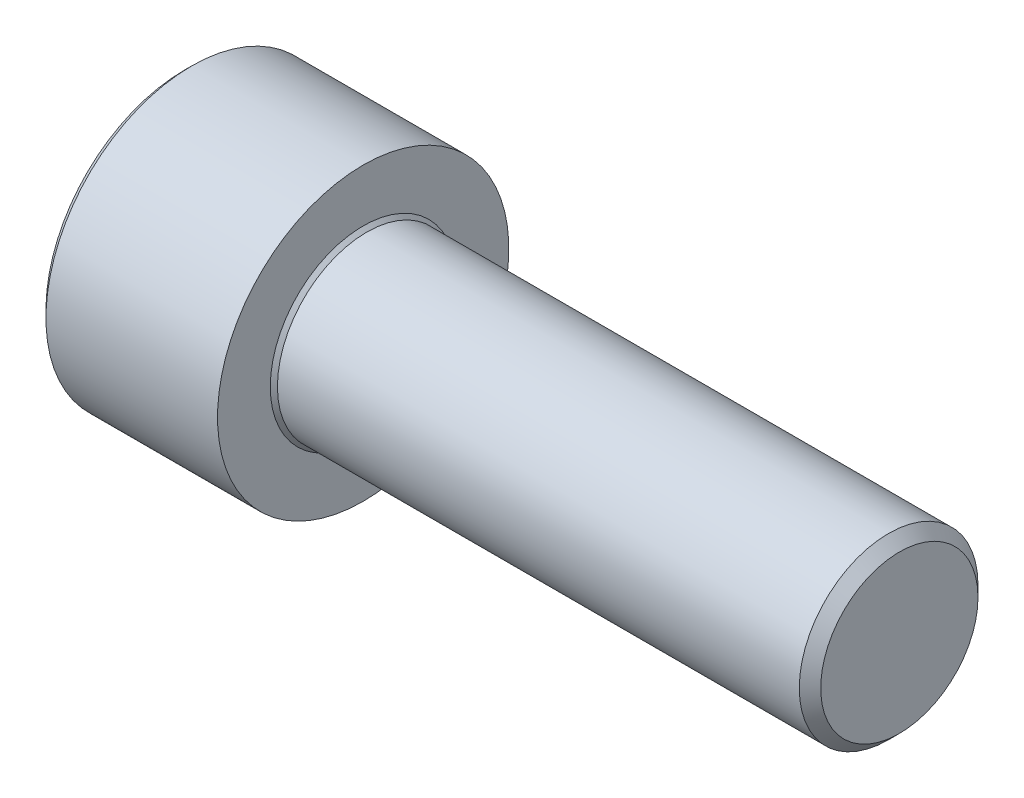
ISO-10303-21;
HEADER;
FILE_DESCRIPTION(('STEP AP214'),'2;1');
FILE_NAME('part.step','',(''),(''),'','','');
FILE_SCHEMA(('AUTOMOTIVE_DESIGN { 1 0 10303 214 1 1 1 1 }'));
ENDSEC;
DATA;
#1=APPLICATION_CONTEXT('core data for automotive mechanical design processes');
#2=APPLICATION_PROTOCOL_DEFINITION('international standard','automotive_design',2000,#1);
#3=PRODUCT_CONTEXT('',#1,'mechanical');
#4=PRODUCT('Part','Part','',(#3));
#5=PRODUCT_RELATED_PRODUCT_CATEGORY('part','',(#4));
#6=PRODUCT_DEFINITION_FORMATION('','',#4);
#7=PRODUCT_DEFINITION_CONTEXT('part definition',#1,'design');
#8=PRODUCT_DEFINITION('design','',#6,#7);
#9=PRODUCT_DEFINITION_SHAPE('','',#8);
#10=(LENGTH_UNIT() NAMED_UNIT(*) SI_UNIT(.MILLI.,.METRE.));
#11=(NAMED_UNIT(*) PLANE_ANGLE_UNIT() SI_UNIT($,.RADIAN.));
#12=(NAMED_UNIT(*) SI_UNIT($,.STERADIAN.) SOLID_ANGLE_UNIT());
#13=UNCERTAINTY_MEASURE_WITH_UNIT(LENGTH_MEASURE(1.E-05),#10,'distance_accuracy_value','');
#14=(GEOMETRIC_REPRESENTATION_CONTEXT(3) GLOBAL_UNCERTAINTY_ASSIGNED_CONTEXT((#13)) GLOBAL_UNIT_ASSIGNED_CONTEXT((#10,
#11,#12)) REPRESENTATION_CONTEXT('',''));
#15=CARTESIAN_POINT('',(0.,0.,0.));
#16=DIRECTION('',(0.,0.,1.));
#17=DIRECTION('',(1.,0.,0.));
#18=AXIS2_PLACEMENT_3D('',#15,#16,#17);
#19=CARTESIAN_POINT('',(-30.,0.,0.));
#20=DIRECTION('',(1.,0.,0.));
#21=DIRECTION('',(0.,0.,-1.));
#22=AXIS2_PLACEMENT_3D('',#19,#20,#21);
#23=CYLINDRICAL_SURFACE('',#22,5.);
#24=CARTESIAN_POINT('',(-29.8,0.,0.));
#25=DIRECTION('',(-1.,0.,0.));
#26=DIRECTION('',(0.,0.,1.));
#27=AXIS2_PLACEMENT_3D('',#24,#25,#26);
#28=CIRCLE('',#27,5.);
#29=CARTESIAN_POINT('',(-29.8,0.,5.));
#30=VERTEX_POINT('',#29);
#31=EDGE_CURVE('E50',#30,#30,#28,.F.);
#32=ORIENTED_EDGE('',*,*,#31,.T.);
#33=EDGE_LOOP('',(#32));
#34=FACE_BOUND('',#33,.T.);
#35=CARTESIAN_POINT('',(-0.600000000000003,0.,0.));
#36=DIRECTION('',(1.,0.,0.));
#37=DIRECTION('',(0.,0.,-1.));
#38=AXIS2_PLACEMENT_3D('',#35,#36,#37);
#39=CIRCLE('',#38,5.);
#40=CARTESIAN_POINT('',(-0.600000000000003,0.,-5.));
#41=VERTEX_POINT('',#40);
#42=EDGE_CURVE('E102',#41,#41,#39,.F.);
#43=ORIENTED_EDGE('',*,*,#42,.T.);
#44=EDGE_LOOP('',(#43));
#45=FACE_BOUND('',#44,.T.);
#46=ADVANCED_FACE('F41',(#34,#45),#23,.T.);
#47=CARTESIAN_POINT('',(0.,0.,0.));
#48=DIRECTION('',(1.,0.,0.));
#49=DIRECTION('',(0.,0.,-1.));
#50=AXIS2_PLACEMENT_3D('',#47,#48,#49);
#51=PLANE('',#50);
#52=CARTESIAN_POINT('',(0.,0.,0.));
#53=DIRECTION('',(1.,0.,0.));
#54=DIRECTION('',(0.,0.,-1.));
#55=AXIS2_PLACEMENT_3D('',#52,#53,#54);
#56=CIRCLE('',#55,4.4);
#57=CARTESIAN_POINT('',(0.,0.,-4.4));
#58=VERTEX_POINT('',#57);
#59=EDGE_CURVE('E128',#58,#58,#56,.T.);
#60=ORIENTED_EDGE('',*,*,#59,.T.);
#61=EDGE_LOOP('',(#60));
#62=FACE_BOUND('',#61,.T.);
#63=ADVANCED_FACE('F204',(#62),#51,.T.);
#64=CARTESIAN_POINT('',(0.,0.,0.));
#65=DIRECTION('',(-1.,0.,0.));
#66=DIRECTION('',(0.,0.,1.));
#67=AXIS2_PLACEMENT_3D('',#64,#65,#66);
#68=CONICAL_SURFACE('',#67,4.4,0.785398163397448);
#69=ORIENTED_EDGE('',*,*,#42,.F.);
#70=EDGE_LOOP('',(#69));
#71=FACE_BOUND('',#70,.T.);
#72=ORIENTED_EDGE('',*,*,#59,.F.);
#73=EDGE_LOOP('',(#72));
#74=FACE_BOUND('',#73,.T.);
#75=ADVANCED_FACE('F212',(#71,#74),#68,.T.);
#76=CARTESIAN_POINT('',(-40.,0.,0.));
#77=DIRECTION('',(1.,0.,0.));
#78=DIRECTION('',(0.,1.,0.));
#79=AXIS2_PLACEMENT_3D('',#76,#77,#78);
#80=PLANE('',#79);
#81=CARTESIAN_POINT('',(-40.,0.,0.));
#82=DIRECTION('',(1.,0.,0.));
#83=DIRECTION('',(0.,1.,0.));
#84=AXIS2_PLACEMENT_3D('',#81,#82,#83);
#85=CIRCLE('',#84,7.75);
#86=CARTESIAN_POINT('',(-40.,7.75,0.));
#87=VERTEX_POINT('',#86);
#88=EDGE_CURVE('E101',#87,#87,#85,.F.);
#89=ORIENTED_EDGE('',*,*,#88,.T.);
#90=EDGE_LOOP('',(#89));
#91=FACE_BOUND('',#90,.T.);
#92=CARTESIAN_POINT('',(-40.,0.,0.));
#93=DIRECTION('',(-1.,0.,0.));
#94=DIRECTION('',(0.,-1.,0.));
#95=AXIS2_PLACEMENT_3D('',#92,#93,#94);
#96=CIRCLE('',#95,4.72653718043601);
#97=CARTESIAN_POINT('',(-40.,-4.72653718043593,0.));
#98=VERTEX_POINT('',#97);
#99=EDGE_CURVE('E259',#98,#98,#96,.T.);
#100=ORIENTED_EDGE('',*,*,#99,.F.);
#101=EDGE_LOOP('',(#100));
#102=FACE_BOUND('',#101,.T.);
#103=ADVANCED_FACE('F220',(#91,#102),#80,.F.);
#104=CARTESIAN_POINT('',(-30.,0.,0.));
#105=DIRECTION('',(-1.,0.,0.));
#106=DIRECTION('',(0.,-1.,0.));
#107=AXIS2_PLACEMENT_3D('',#104,#105,#106);
#108=CYLINDRICAL_SURFACE('',#107,8.15);
#109=CARTESIAN_POINT('',(-39.6,0.,0.));
#110=DIRECTION('',(1.,0.,0.));
#111=DIRECTION('',(0.,1.,0.));
#112=AXIS2_PLACEMENT_3D('',#109,#110,#111);
#113=CIRCLE('',#112,8.15);
#114=CARTESIAN_POINT('',(-39.6,8.15,0.));
#115=VERTEX_POINT('',#114);
#116=EDGE_CURVE('E236',#115,#115,#113,.T.);
#117=ORIENTED_EDGE('',*,*,#116,.T.);
#118=EDGE_LOOP('',(#117));
#119=FACE_BOUND('',#118,.T.);
#120=CARTESIAN_POINT('',(-30.,0.,0.));
#121=DIRECTION('',(-1.,0.,0.));
#122=DIRECTION('',(0.,-1.,0.));
#123=AXIS2_PLACEMENT_3D('',#120,#121,#122);
#124=CIRCLE('',#123,8.15);
#125=CARTESIAN_POINT('',(-30.,-8.15,0.));
#126=VERTEX_POINT('',#125);
#127=EDGE_CURVE('E125',#126,#126,#124,.T.);
#128=ORIENTED_EDGE('',*,*,#127,.T.);
#129=EDGE_LOOP('',(#128));
#130=FACE_BOUND('',#129,.T.);
#131=ADVANCED_FACE('F243',(#119,#130),#108,.T.);
#132=CARTESIAN_POINT('',(-30.,8.15,0.));
#133=DIRECTION('',(-1.,0.,0.));
#134=DIRECTION('',(0.,-1.,0.));
#135=AXIS2_PLACEMENT_3D('',#132,#133,#134);
#136=PLANE('',#135);
#137=CARTESIAN_POINT('',(-30.,0.,0.));
#138=DIRECTION('',(-1.,0.,0.));
#139=DIRECTION('',(0.,-1.,0.));
#140=AXIS2_PLACEMENT_3D('',#137,#138,#139);
#141=CIRCLE('',#140,5.20000000000001);
#142=CARTESIAN_POINT('',(-30.,-5.20000000000002,0.));
#143=VERTEX_POINT('',#142);
#144=EDGE_CURVE('E11',#143,#143,#141,.T.);
#145=ORIENTED_EDGE('',*,*,#144,.T.);
#146=EDGE_LOOP('',(#145));
#147=FACE_BOUND('',#146,.T.);
#148=ORIENTED_EDGE('',*,*,#127,.F.);
#149=EDGE_LOOP('',(#148));
#150=FACE_BOUND('',#149,.T.);
#151=ADVANCED_FACE('F147',(#147,#150),#136,.F.);
#152=CARTESIAN_POINT('',(-40.,0.,0.));
#153=DIRECTION('',(-1.,0.,0.));
#154=DIRECTION('',(0.,-1.,0.));
#155=AXIS2_PLACEMENT_3D('',#152,#153,#154);
#156=CONICAL_SURFACE('',#155,4.72653718043601,0.78539816339745);
#157=ORIENTED_EDGE('',*,*,#99,.T.);
#158=EDGE_LOOP('',(#157));
#159=FACE_BOUND('',#158,.T.);
#160=CARTESIAN_POINT('',(-41.5309516083699,-4.77008028674897,4.05));
#161=CARTESIAN_POINT('',(-41.4427901157094,-4.65440208940426,4.05));
#162=CARTESIAN_POINT('',(-41.3554492616628,-4.53808829522071,4.05));
#163=CARTESIAN_POINT('',(-41.182780006872,-4.30393425494875,4.05));
#164=CARTESIAN_POINT('',(-41.0974521018661,-4.18609364368859,4.05));
#165=CARTESIAN_POINT('',(-40.9285726626745,-3.9477687193443,4.05));
#166=CARTESIAN_POINT('',(-40.8450399737617,-3.82727100769475,4.05));
#167=CARTESIAN_POINT('',(-40.6809856344681,-3.58424949304609,4.05));
#168=CARTESIAN_POINT('',(-40.6004637741886,-3.4617258321473,4.05));
#169=CARTESIAN_POINT('',(-40.4383704749454,-3.20687072237944,4.05));
#170=CARTESIAN_POINT('',(-40.3570278695866,-3.07439299191408,4.05));
#171=CARTESIAN_POINT('',(-40.1995410642375,-2.80633475973344,4.05));
#172=CARTESIAN_POINT('',(-40.1233977133451,-2.67075375602234,4.05));
#173=CARTESIAN_POINT('',(-39.9779418893051,-2.39647687832663,4.05));
#174=CARTESIAN_POINT('',(-39.9086093396334,-2.25779173540599,4.05));
#175=CARTESIAN_POINT('',(-39.7783279865193,-1.97656933187869,4.05));
#176=CARTESIAN_POINT('',(-39.7173753070564,-1.83403388893849,4.05));
#177=CARTESIAN_POINT('',(-39.6110390231793,-1.55782245656059,4.05));
#178=CARTESIAN_POINT('',(-39.5647492126337,-1.42449895488158,4.05));
#179=CARTESIAN_POINT('',(-39.4828521459998,-1.15454887331449,4.05));
#180=CARTESIAN_POINT('',(-39.4472455970156,-1.01792207543419,4.05));
#181=CARTESIAN_POINT('',(-39.3892002813461,-0.744506023271173,4.05));
#182=CARTESIAN_POINT('',(-39.3665292547426,-0.607766906578177,4.05));
#183=CARTESIAN_POINT('',(-39.3348120501017,-0.332708961602893,4.05));
#184=CARTESIAN_POINT('',(-39.3257632987791,-0.19439043665057,4.05));
#185=CARTESIAN_POINT('',(-39.3220120657331,0.076933819136654,4.05));
#186=CARTESIAN_POINT('',(-39.3267531905602,0.209932003462803,4.05));
#187=CARTESIAN_POINT('',(-39.3490661829107,0.474840474367155,4.05));
#188=CARTESIAN_POINT('',(-39.3666392586507,0.606750657319686,4.05));
#189=CARTESIAN_POINT('',(-39.4139389304768,0.870760818374776,4.05));
#190=CARTESIAN_POINT('',(-39.4438761522848,1.0028224347568,4.05));
#191=CARTESIAN_POINT('',(-39.5142758184288,1.26405392041009,4.05));
#192=CARTESIAN_POINT('',(-39.5547375195833,1.39322399316723,4.05));
#193=CARTESIAN_POINT('',(-39.6478194158708,1.65801102597629,4.05));
#194=CARTESIAN_POINT('',(-39.701123949786,1.79338481728442,4.05));
#195=CARTESIAN_POINT('',(-39.8159447825894,2.0606347886873,4.05));
#196=CARTESIAN_POINT('',(-39.8774648426826,2.19250933342231,4.05));
#197=CARTESIAN_POINT('',(-40.0072557545298,2.45339368019737,4.05));
#198=CARTESIAN_POINT('',(-40.0755475953344,2.58239295504825,4.05));
#199=CARTESIAN_POINT('',(-40.2173761007312,2.83742974750939,4.05));
#200=CARTESIAN_POINT('',(-40.2909119452575,2.96346772413184,4.05));
#201=CARTESIAN_POINT('',(-40.4384533466788,3.20679173979139,4.05));
#202=CARTESIAN_POINT('',(-40.5122551150023,3.32420200355068,4.05));
#203=CARTESIAN_POINT('',(-40.6629828661655,3.55700597479234,4.05));
#204=CARTESIAN_POINT('',(-40.7399090844353,3.67239952937335,4.05));
#205=CARTESIAN_POINT('',(-40.895697399084,3.90050236579838,4.05));
#206=CARTESIAN_POINT('',(-40.9745388514795,4.01322579773707,4.05));
#207=CARTESIAN_POINT('',(-41.1343222844576,4.23712889031962,4.05));
#208=CARTESIAN_POINT('',(-41.2152636805579,4.34830896758044,4.05));
#209=CARTESIAN_POINT('',(-41.2970641777538,4.45884215042274,4.05));
#210=B_SPLINE_CURVE_WITH_KNOTS('',3,(#160,#161,#162,#163,#164,#165,#166,#167,#168,#169,#170,
#171,#172,#173,#174,#175,#176,#177,#178,#179,#180,#181,#182,#183,#184,#185,#186,#187,#188,#189,
#190,#191,#192,#193,#194,#195,#196,#197,#198,#199,#200,#201,#202,#203,#204,#205,#206,#207,#208,
#209),.UNSPECIFIED.,.F.,.F.,(4,2,2,2,2,2,2,2,2,2,2,2,2,2,2,2,2,2,2,2,2,2,2,2,4),(0.,
0.436339668159914,0.872785697012619,1.31260761574299,1.75239881508181,2.21867580978092,
2.68502877164901,3.14996297014922,3.61468138948595,4.03770545430504,4.46075751207832,
4.87595303107271,5.29107010865035,5.68967327970307,6.08831398682756,6.49404568894108,
6.89974874826397,7.33588278875893,7.77221718763243,8.20994898794345,8.64761248450556,
9.06359150762746,9.47960193350272,9.89225363210171,10.3047916831176),.UNSPECIFIED.);
#211=CARTESIAN_POINT('',(-39.95,-2.33826859021787,4.05));
#212=VERTEX_POINT('',#211);
#213=CARTESIAN_POINT('',(-39.95,2.3382685902181,4.05));
#214=VERTEX_POINT('',#213);
#215=EDGE_CURVE('E109',#212,#214,#210,.T.);
#216=ORIENTED_EDGE('',*,*,#215,.F.);
#217=CARTESIAN_POINT('',(-39.9501154743303,-4.67665265048969,-0.000200000000000586));
#218=CARTESIAN_POINT('',(-39.9099126038853,-4.6364455899658,0.0694406716503773));
#219=CARTESIAN_POINT('',(-39.8709431392429,-4.59593085156483,0.139614257016226));
#220=CARTESIAN_POINT('',(-39.7958469873764,-4.51422264022539,0.281137030451704));
#221=CARTESIAN_POINT('',(-39.7597218528459,-4.4730288112133,0.352486835258947));
#222=CARTESIAN_POINT('',(-39.6558688049565,-4.34795085934828,0.569128202795816));
#223=CARTESIAN_POINT('',(-39.5931063446014,-4.26300370103608,0.716260996951156));
#224=CARTESIAN_POINT('',(-39.4856223890752,-4.09173416628499,1.01290853292872));
#225=CARTESIAN_POINT('',(-39.440630225364,-4.00545505110279,1.16234834405638));
#226=CARTESIAN_POINT('',(-39.3713044521116,-3.83099164991719,1.46452781897112));
#227=CARTESIAN_POINT('',(-39.3469191198142,-3.74281270700138,1.61725822825902));
#228=CARTESIAN_POINT('',(-39.3249177959791,-3.59083970687842,1.88048318585066));
#229=CARTESIAN_POINT('',(-39.3216616464362,-3.5272414493363,1.99063859918645));
#230=CARTESIAN_POINT('',(-39.3271505849848,-3.40014815914414,2.21077063510038));
#231=CARTESIAN_POINT('',(-39.3358998801513,-3.33665317049044,2.32074718147459));
#232=CARTESIAN_POINT('',(-39.3649006554948,-3.21026482231659,2.5396582219964));
#233=CARTESIAN_POINT('',(-39.3851650001114,-3.14737221581363,2.64859141187997));
#234=CARTESIAN_POINT('',(-39.4360896826349,-3.02266714910294,2.86458692338414));
#235=CARTESIAN_POINT('',(-39.4667492234541,-2.9608546064596,2.97164938778743));
#236=CARTESIAN_POINT('',(-39.5298279811714,-2.8511226134439,3.16171077490641));
#237=CARTESIAN_POINT('',(-39.5605886775098,-2.80296021369033,3.24513049829404));
#238=CARTESIAN_POINT('',(-39.6270673734929,-2.70750001395524,3.41047241433589));
#239=CARTESIAN_POINT('',(-39.662785523927,-2.66020224032233,3.49239456135297));
#240=CARTESIAN_POINT('',(-39.7383784216793,-2.56662030906034,3.65448322096916));
#241=CARTESIAN_POINT('',(-39.778240098154,-2.52033348979663,3.73465434365467));
#242=CARTESIAN_POINT('',(-39.8615966089899,-2.42861702649726,3.8935119179797));
#243=CARTESIAN_POINT('',(-39.9050892143742,-2.38318687726082,3.97219924465265));
#244=CARTESIAN_POINT('',(-39.9501154743304,-2.33815312016404,4.0502));
#245=B_SPLINE_CURVE_WITH_KNOTS('',3,(#217,#218,#219,#220,#221,#222,#223,#224,#225,#226,#227,
#228,#229,#230,#231,#232,#233,#234,#235,#236,#237,#238,#239,#240,#241,#242,#243,#244),
.UNSPECIFIED.,.F.,.F.,(4,2,2,2,2,2,2,2,2,2,2,2,2,4),(0.,0.269691144423312,0.539528504474146,
1.08211675661035,1.61608853490854,2.14871603931449,2.52989214669459,2.91120186395841,
3.29293841456949,3.67464570082543,3.97785508952931,4.28107370288429,4.58336327483854,
4.88546862108453),.UNSPECIFIED.);
#246=CARTESIAN_POINT('',(-39.9499999999999,-4.67653718043585,0.));
#247=VERTEX_POINT('',#246);
#248=EDGE_CURVE('E169',#247,#212,#245,.T.);
#249=ORIENTED_EDGE('',*,*,#248,.F.);
#250=CARTESIAN_POINT('',(-39.9501154743304,-2.33815312016403,-4.0502));
#251=CARTESIAN_POINT('',(-39.9099126038853,-2.37836018068793,-3.98055932834962));
#252=CARTESIAN_POINT('',(-39.8709431392429,-2.4188749190889,-3.91038574298377));
#253=CARTESIAN_POINT('',(-39.7958469873764,-2.50058313042834,-3.76886296954829));
#254=CARTESIAN_POINT('',(-39.7597218528459,-2.54177695944043,-3.69751316474105));
#255=CARTESIAN_POINT('',(-39.6558688049565,-2.66685491130545,-3.48087179720418));
#256=CARTESIAN_POINT('',(-39.5931063446014,-2.75180206961766,-3.33373900304883));
#257=CARTESIAN_POINT('',(-39.4856223890752,-2.92307160436875,-3.03709146707126));
#258=CARTESIAN_POINT('',(-39.440630225364,-3.00935071955095,-2.8876516559436));
#259=CARTESIAN_POINT('',(-39.3713044521116,-3.18381412073656,-2.58547218102885));
#260=CARTESIAN_POINT('',(-39.3469191198142,-3.27199306365237,-2.43274177174095));
#261=CARTESIAN_POINT('',(-39.3249177959791,-3.42396606377533,-2.16951681414931));
#262=CARTESIAN_POINT('',(-39.3216616464362,-3.48756432131744,-2.05936140081352));
#263=CARTESIAN_POINT('',(-39.3271505849848,-3.61465761150961,-1.83922936489959));
#264=CARTESIAN_POINT('',(-39.3358998801513,-3.67815260016331,-1.72925281852538));
#265=CARTESIAN_POINT('',(-39.3649006554948,-3.80454094833716,-1.51034177800357));
#266=CARTESIAN_POINT('',(-39.3851650001114,-3.86743355484012,-1.40140858812));
#267=CARTESIAN_POINT('',(-39.4360896826349,-3.99213862155081,-1.18541307661583));
#268=CARTESIAN_POINT('',(-39.4667492234541,-4.05395116419415,-1.07835061221254));
#269=CARTESIAN_POINT('',(-39.5298279811714,-4.16368315720985,-0.888289225093556));
#270=CARTESIAN_POINT('',(-39.5605886775098,-4.21184555696342,-0.804869501705936));
#271=CARTESIAN_POINT('',(-39.6270673734929,-4.3073057566985,-0.639527585664092));
#272=CARTESIAN_POINT('',(-39.662785523927,-4.35460353033141,-0.55760543864701));
#273=CARTESIAN_POINT('',(-39.7383784216793,-4.4481854615934,-0.395516779030827));
#274=CARTESIAN_POINT('',(-39.778240098154,-4.49447228085711,-0.315345656345318));
#275=CARTESIAN_POINT('',(-39.8615966089899,-4.58618874415647,-0.156488082020293));
#276=CARTESIAN_POINT('',(-39.9050892143742,-4.63161889339291,-0.077800755347345));
#277=CARTESIAN_POINT('',(-39.9501154743303,-4.67665265048969,0.000200000000000201));
#278=B_SPLINE_CURVE_WITH_KNOTS('',3,(#250,#251,#252,#253,#254,#255,#256,#257,#258,#259,#260,
#261,#262,#263,#264,#265,#266,#267,#268,#269,#270,#271,#272,#273,#274,#275,#276,#277),
.UNSPECIFIED.,.F.,.F.,(4,2,2,2,2,2,2,2,2,2,2,2,2,4),(0.,0.269691144423317,0.539528504474156,
1.08211675661037,1.61608853490857,2.14871603931453,2.52989214669463,2.91120186395845,
3.29293841456953,3.67464570082548,3.97785508952934,4.28107370288431,4.58336327483855,
4.88546862108454),.UNSPECIFIED.);
#279=CARTESIAN_POINT('',(-39.95,-2.33826859021787,-4.05));
#280=VERTEX_POINT('',#279);
#281=EDGE_CURVE('E162',#280,#247,#278,.T.);
#282=ORIENTED_EDGE('',*,*,#281,.F.);
#283=CARTESIAN_POINT('',(-41.5309516083699,-4.77008028674897,-4.05));
#284=CARTESIAN_POINT('',(-41.4427901157094,-4.65440208940426,-4.05));
#285=CARTESIAN_POINT('',(-41.3554492616628,-4.53808829522071,-4.05));
#286=CARTESIAN_POINT('',(-41.182780006872,-4.30393425494875,-4.05));
#287=CARTESIAN_POINT('',(-41.0974521018661,-4.18609364368859,-4.05));
#288=CARTESIAN_POINT('',(-40.9285726626745,-3.9477687193443,-4.05));
#289=CARTESIAN_POINT('',(-40.8450399737617,-3.82727100769475,-4.05));
#290=CARTESIAN_POINT('',(-40.6809856344681,-3.58424949304609,-4.05));
#291=CARTESIAN_POINT('',(-40.6004637741886,-3.4617258321473,-4.05));
#292=CARTESIAN_POINT('',(-40.4383704749454,-3.20687072237944,-4.05));
#293=CARTESIAN_POINT('',(-40.3570278695866,-3.07439299191408,-4.05));
#294=CARTESIAN_POINT('',(-40.1995410642375,-2.80633475973344,-4.05));
#295=CARTESIAN_POINT('',(-40.1233977133451,-2.67075375602234,-4.05));
#296=CARTESIAN_POINT('',(-39.9779418893051,-2.39647687832663,-4.05));
#297=CARTESIAN_POINT('',(-39.9086093396334,-2.25779173540599,-4.05));
#298=CARTESIAN_POINT('',(-39.7783279865193,-1.97656933187869,-4.05));
#299=CARTESIAN_POINT('',(-39.7173753070564,-1.83403388893849,-4.05));
#300=CARTESIAN_POINT('',(-39.6110390231793,-1.55782245656059,-4.05));
#301=CARTESIAN_POINT('',(-39.5647492126337,-1.42449895488158,-4.05));
#302=CARTESIAN_POINT('',(-39.4828521459998,-1.15454887331449,-4.05));
#303=CARTESIAN_POINT('',(-39.4472455970156,-1.01792207543419,-4.05));
#304=CARTESIAN_POINT('',(-39.3892002813461,-0.744506023271172,-4.05));
#305=CARTESIAN_POINT('',(-39.3665292547426,-0.607766906578175,-4.05));
#306=CARTESIAN_POINT('',(-39.3348120501017,-0.332708961602892,-4.05));
#307=CARTESIAN_POINT('',(-39.3257632987791,-0.194390436650569,-4.05));
#308=CARTESIAN_POINT('',(-39.3220120657331,0.076933819136655,-4.05));
#309=CARTESIAN_POINT('',(-39.3267531905602,0.209932003462804,-4.05));
#310=CARTESIAN_POINT('',(-39.3490661829107,0.474840474367156,-4.05));
#311=CARTESIAN_POINT('',(-39.3666392586507,0.606750657319686,-4.05));
#312=CARTESIAN_POINT('',(-39.4139389304768,0.870760818374776,-4.05));
#313=CARTESIAN_POINT('',(-39.4438761522848,1.0028224347568,-4.05));
#314=CARTESIAN_POINT('',(-39.5142758184288,1.26405392041009,-4.05));
#315=CARTESIAN_POINT('',(-39.5547375195833,1.39322399316723,-4.05));
#316=CARTESIAN_POINT('',(-39.6478194158708,1.65801102597629,-4.05));
#317=CARTESIAN_POINT('',(-39.701123949786,1.79338481728442,-4.05));
#318=CARTESIAN_POINT('',(-39.8159447825894,2.0606347886873,-4.05));
#319=CARTESIAN_POINT('',(-39.8774648426826,2.19250933342231,-4.05));
#320=CARTESIAN_POINT('',(-40.0072557545298,2.45339368019737,-4.05));
#321=CARTESIAN_POINT('',(-40.0755475953344,2.58239295504825,-4.05));
#322=CARTESIAN_POINT('',(-40.2173761007312,2.83742974750939,-4.05));
#323=CARTESIAN_POINT('',(-40.2909119452575,2.96346772413184,-4.05));
#324=CARTESIAN_POINT('',(-40.4384533466788,3.20679173979139,-4.05));
#325=CARTESIAN_POINT('',(-40.5122551150023,3.32420200355068,-4.05));
#326=CARTESIAN_POINT('',(-40.6629828661655,3.55700597479234,-4.05));
#327=CARTESIAN_POINT('',(-40.7399090844353,3.67239952937335,-4.05));
#328=CARTESIAN_POINT('',(-40.895697399084,3.90050236579838,-4.05));
#329=CARTESIAN_POINT('',(-40.9745388514795,4.01322579773707,-4.05));
#330=CARTESIAN_POINT('',(-41.1343222844576,4.23712889031962,-4.05));
#331=CARTESIAN_POINT('',(-41.2152636805579,4.34830896758044,-4.05));
#332=CARTESIAN_POINT('',(-41.2970641777538,4.45884215042274,-4.05));
#333=B_SPLINE_CURVE_WITH_KNOTS('',3,(#283,#284,#285,#286,#287,#288,#289,#290,#291,#292,#293,
#294,#295,#296,#297,#298,#299,#300,#301,#302,#303,#304,#305,#306,#307,#308,#309,#310,#311,#312,
#313,#314,#315,#316,#317,#318,#319,#320,#321,#322,#323,#324,#325,#326,#327,#328,#329,#330,#331,
#332),.UNSPECIFIED.,.F.,.F.,(4,2,2,2,2,2,2,2,2,2,2,2,2,2,2,2,2,2,2,2,2,2,2,2,4),(0.,
0.436339668159913,0.872785697012618,1.31260761574298,1.75239881508181,2.21867580978092,
2.68502877164901,3.14996297014922,3.61468138948595,4.03770545430504,4.46075751207832,
4.87595303107271,5.29107010865035,5.68967327970307,6.08831398682756,6.49404568894107,
6.89974874826396,7.33588278875893,7.77221718763243,8.20994898794345,8.64761248450556,
9.06359150762746,9.47960193350272,9.89225363210171,10.3047916831176),.UNSPECIFIED.);
#334=CARTESIAN_POINT('',(-39.95,2.3382685902181,-4.05));
#335=VERTEX_POINT('',#334);
#336=EDGE_CURVE('E57',#335,#280,#333,.F.);
#337=ORIENTED_EDGE('',*,*,#336,.F.);
#338=CARTESIAN_POINT('',(-39.9501154743304,4.67665265048992,0.000200000000000914));
#339=CARTESIAN_POINT('',(-39.9099126038854,4.63644558996603,-0.0694406716503789));
#340=CARTESIAN_POINT('',(-39.8709431392429,4.59593085156505,-0.13961425701623));
#341=CARTESIAN_POINT('',(-39.7958469873765,4.51422264022562,-0.28113703045171));
#342=CARTESIAN_POINT('',(-39.759721852846,4.47302881121353,-0.352486835258953));
#343=CARTESIAN_POINT('',(-39.6558688049565,4.34795085934851,-0.569128202795823));
#344=CARTESIAN_POINT('',(-39.5931063446014,4.2630037010363,-0.716260996951165));
#345=CARTESIAN_POINT('',(-39.4856223890752,4.09173416628521,-1.01290853292873));
#346=CARTESIAN_POINT('',(-39.440630225364,4.00545505110301,-1.1623483440564));
#347=CARTESIAN_POINT('',(-39.3713044521116,3.8309916499174,-1.46452781897114));
#348=CARTESIAN_POINT('',(-39.3469191198142,3.74281270700159,-1.61725822825904));
#349=CARTESIAN_POINT('',(-39.3249177959792,3.59083970687862,-1.88048318585069));
#350=CARTESIAN_POINT('',(-39.3216616464362,3.52724144933651,-1.99063859918648));
#351=CARTESIAN_POINT('',(-39.3271505849848,3.40014815914434,-2.21077063510041));
#352=CARTESIAN_POINT('',(-39.3358998801513,3.33665317049064,-2.32074718147463));
#353=CARTESIAN_POINT('',(-39.3649006554949,3.21026482231679,-2.53965822199644));
#354=CARTESIAN_POINT('',(-39.3851650001115,3.14737221581383,-2.64859141188001));
#355=CARTESIAN_POINT('',(-39.436089682635,3.02266714910314,-2.86458692338419));
#356=CARTESIAN_POINT('',(-39.4667492234542,2.9608546064598,-2.97164938778748));
#357=CARTESIAN_POINT('',(-39.5298279811715,2.8511226134441,-3.16171077490646));
#358=CARTESIAN_POINT('',(-39.5605886775099,2.80296021369053,-3.24513049829407));
#359=CARTESIAN_POINT('',(-39.627067373493,2.70750001395545,-3.41047241433592));
#360=CARTESIAN_POINT('',(-39.6627855239271,2.66020224032255,-3.492394561353));
#361=CARTESIAN_POINT('',(-39.7383784216793,2.56662030906056,-3.65448322096918));
#362=CARTESIAN_POINT('',(-39.778240098154,2.52033348979684,-3.73465434365469));
#363=CARTESIAN_POINT('',(-39.86159660899,2.42861702649748,-3.89351191797971));
#364=CARTESIAN_POINT('',(-39.9050892143742,2.38318687726104,-3.97219924465266));
#365=CARTESIAN_POINT('',(-39.9501154743304,2.33815312016426,-4.0502));
#366=B_SPLINE_CURVE_WITH_KNOTS('',3,(#338,#339,#340,#341,#342,#343,#344,#345,#346,#347,#348,
#349,#350,#351,#352,#353,#354,#355,#356,#357,#358,#359,#360,#361,#362,#363,#364,#365),
.UNSPECIFIED.,.F.,.F.,(4,2,2,2,2,2,2,2,2,2,2,2,2,4),(0.,0.269691144423319,0.539528504474153,
1.08211675661037,1.61608853490856,2.14871603931452,2.52989214669463,2.91120186395846,
3.29293841456954,3.67464570082549,3.97785508952935,4.28107370288432,4.58336327483855,
4.88546862108453),.UNSPECIFIED.);
#367=CARTESIAN_POINT('',(-39.95,4.67653718043609,0.));
#368=VERTEX_POINT('',#367);
#369=EDGE_CURVE('E94',#368,#335,#366,.T.);
#370=ORIENTED_EDGE('',*,*,#369,.F.);
#371=CARTESIAN_POINT('',(-39.9501154743304,2.33815312016426,4.0502));
#372=CARTESIAN_POINT('',(-39.9099126038854,2.37836018068815,3.98055932834962));
#373=CARTESIAN_POINT('',(-39.8709431392429,2.41887491908913,3.91038574298377));
#374=CARTESIAN_POINT('',(-39.7958469873765,2.50058313042856,3.76886296954829));
#375=CARTESIAN_POINT('',(-39.7597218528459,2.54177695944065,3.69751316474105));
#376=CARTESIAN_POINT('',(-39.6558688049565,2.66685491130567,3.48087179720418));
#377=CARTESIAN_POINT('',(-39.5931063446014,2.75180206961788,3.33373900304884));
#378=CARTESIAN_POINT('',(-39.4856223890752,2.92307160436896,3.03709146707128));
#379=CARTESIAN_POINT('',(-39.440630225364,3.00935071955116,2.88765165594362));
#380=CARTESIAN_POINT('',(-39.3713044521116,3.18381412073677,2.58547218102888));
#381=CARTESIAN_POINT('',(-39.3469191198142,3.27199306365258,2.43274177174098));
#382=CARTESIAN_POINT('',(-39.3249177959792,3.42396606377554,2.16951681414934));
#383=CARTESIAN_POINT('',(-39.3216616464362,3.48756432131765,2.05936140081355));
#384=CARTESIAN_POINT('',(-39.3271505849848,3.61465761150982,1.83922936489962));
#385=CARTESIAN_POINT('',(-39.3358998801513,3.67815260016352,1.7292528185254));
#386=CARTESIAN_POINT('',(-39.3649006554949,3.80454094833737,1.51034177800359));
#387=CARTESIAN_POINT('',(-39.3851650001115,3.86743355484033,1.40140858812002));
#388=CARTESIAN_POINT('',(-39.436089682635,3.99213862155102,1.18541307661584));
#389=CARTESIAN_POINT('',(-39.4667492234542,4.05395116419437,1.07835061221255));
#390=CARTESIAN_POINT('',(-39.5298279811715,4.16368315721007,0.888289225093571));
#391=CARTESIAN_POINT('',(-39.5605886775099,4.21184555696363,0.80486950170595));
#392=CARTESIAN_POINT('',(-39.627067373493,4.30730575669872,0.639527585664102));
#393=CARTESIAN_POINT('',(-39.6627855239271,4.35460353033163,0.557605438647018));
#394=CARTESIAN_POINT('',(-39.7383784216793,4.44818546159362,0.395516779030832));
#395=CARTESIAN_POINT('',(-39.778240098154,4.49447228085733,0.315345656345323));
#396=CARTESIAN_POINT('',(-39.86159660899,4.5861887441567,0.156488082020295));
#397=CARTESIAN_POINT('',(-39.9050892143742,4.63161889339314,0.0778007553473458));
#398=CARTESIAN_POINT('',(-39.9501154743304,4.67665265048992,-0.000199999999998901));
#399=B_SPLINE_CURVE_WITH_KNOTS('',3,(#371,#372,#373,#374,#375,#376,#377,#378,#379,#380,#381,
#382,#383,#384,#385,#386,#387,#388,#389,#390,#391,#392,#393,#394,#395,#396,#397,#398),
.UNSPECIFIED.,.F.,.F.,(4,2,2,2,2,2,2,2,2,2,2,2,2,4),(0.,0.269691144423313,0.539528504474148,
1.08211675661035,1.61608853490854,2.14871603931449,2.52989214669459,2.91120186395842,
3.29293841456951,3.67464570082545,3.97785508952932,4.2810737028843,4.58336327483853,
4.88546862108453),.UNSPECIFIED.);
#400=EDGE_CURVE('E97',#214,#368,#399,.T.);
#401=ORIENTED_EDGE('',*,*,#400,.F.);
#402=EDGE_LOOP('',(#216,#249,#282,#337,#370,#401));
#403=FACE_BOUND('',#402,.T.);
#404=ADVANCED_FACE('F96',(#159,#403),#156,.F.);
#405=CARTESIAN_POINT('',(-35.,2.18314151286095E-13,0.));
#406=DIRECTION('',(-1.,0.,0.));
#407=DIRECTION('',(0.,-1.,0.));
#408=AXIS2_PLACEMENT_3D('',#405,#406,#407);
#409=PLANE('',#408);
#410=DIRECTION('',(0.,0.5,-0.866025403784438));
#411=VECTOR('',#410,1.);
#412=CARTESIAN_POINT('',(-35.,2.33826859021808,4.05));
#413=LINE('',#412,#411);
#414=CARTESIAN_POINT('',(-35.,2.33826859021808,4.05));
#415=VERTEX_POINT('',#414);
#416=CARTESIAN_POINT('',(-35.,4.67653718043606,0.));
#417=VERTEX_POINT('',#416);
#418=EDGE_CURVE('E108',#415,#417,#413,.T.);
#419=ORIENTED_EDGE('',*,*,#418,.T.);
#420=DIRECTION('',(0.,-0.5,-0.866025403784439));
#421=VECTOR('',#420,1.);
#422=CARTESIAN_POINT('',(-35.,4.67653718043606,0.));
#423=LINE('',#422,#421);
#424=CARTESIAN_POINT('',(-35.,2.33826859021808,-4.05));
#425=VERTEX_POINT('',#424);
#426=EDGE_CURVE('E113',#417,#425,#423,.T.);
#427=ORIENTED_EDGE('',*,*,#426,.T.);
#428=DIRECTION('',(0.,-1.,0.));
#429=VECTOR('',#428,1.);
#430=CARTESIAN_POINT('',(-35.,2.33826859021808,-4.05));
#431=LINE('',#430,#429);
#432=CARTESIAN_POINT('',(-35.,-2.33826859021789,-4.05));
#433=VERTEX_POINT('',#432);
#434=EDGE_CURVE('E277',#425,#433,#431,.T.);
#435=ORIENTED_EDGE('',*,*,#434,.T.);
#436=DIRECTION('',(0.,-0.5,0.866025403784438));
#437=VECTOR('',#436,1.);
#438=CARTESIAN_POINT('',(-35.,-2.33826859021789,-4.05));
#439=LINE('',#438,#437);
#440=CARTESIAN_POINT('',(-35.,-4.67653718043587,0.));
#441=VERTEX_POINT('',#440);
#442=EDGE_CURVE('E274',#433,#441,#439,.T.);
#443=ORIENTED_EDGE('',*,*,#442,.T.);
#444=DIRECTION('',(0.,0.5,0.866025403784439));
#445=VECTOR('',#444,1.);
#446=CARTESIAN_POINT('',(-35.,-4.67653718043587,0.));
#447=LINE('',#446,#445);
#448=CARTESIAN_POINT('',(-35.,-2.33826859021789,4.05));
#449=VERTEX_POINT('',#448);
#450=EDGE_CURVE('E121',#441,#449,#447,.T.);
#451=ORIENTED_EDGE('',*,*,#450,.T.);
#452=DIRECTION('',(0.,1.,0.));
#453=VECTOR('',#452,1.);
#454=CARTESIAN_POINT('',(-35.,-2.33826859021789,4.05));
#455=LINE('',#454,#453);
#456=EDGE_CURVE('E116',#449,#415,#455,.T.);
#457=ORIENTED_EDGE('',*,*,#456,.T.);
#458=EDGE_LOOP('',(#419,#427,#435,#443,#451,#457));
#459=FACE_BOUND('',#458,.T.);
#460=ADVANCED_FACE('F146',(#459),#409,.T.);
#461=CARTESIAN_POINT('',(-35.,4.67653718043606,0.));
#462=DIRECTION('',(0.,0.866025403784439,-0.5));
#463=DIRECTION('',(0.,0.5,0.866025403784439));
#464=AXIS2_PLACEMENT_3D('',#461,#462,#463);
#465=PLANE('',#464);
#466=DIRECTION('',(-1.,0.,0.));
#467=VECTOR('',#466,1.);
#468=CARTESIAN_POINT('',(-35.,4.67653718043606,0.));
#469=LINE('',#468,#467);
#470=EDGE_CURVE('E106',#417,#368,#469,.T.);
#471=ORIENTED_EDGE('',*,*,#470,.T.);
#472=ORIENTED_EDGE('',*,*,#369,.T.);
#473=DIRECTION('',(-1.,0.,0.));
#474=VECTOR('',#473,1.);
#475=CARTESIAN_POINT('',(-35.,2.33826859021808,-4.05));
#476=LINE('',#475,#474);
#477=EDGE_CURVE('E115',#425,#335,#476,.T.);
#478=ORIENTED_EDGE('',*,*,#477,.F.);
#479=ORIENTED_EDGE('',*,*,#426,.F.);
#480=EDGE_LOOP('',(#471,#472,#478,#479));
#481=FACE_BOUND('',#480,.T.);
#482=ADVANCED_FACE('F111',(#481),#465,.F.);
#483=CARTESIAN_POINT('',(-35.,2.33826859021808,-4.05));
#484=DIRECTION('',(0.,0.,-1.));
#485=DIRECTION('',(-1.,0.,0.));
#486=AXIS2_PLACEMENT_3D('',#483,#484,#485);
#487=PLANE('',#486);
#488=ORIENTED_EDGE('',*,*,#477,.T.);
#489=ORIENTED_EDGE('',*,*,#336,.T.);
#490=DIRECTION('',(-1.,0.,0.));
#491=VECTOR('',#490,1.);
#492=CARTESIAN_POINT('',(-35.,-2.33826859021789,-4.05));
#493=LINE('',#492,#491);
#494=EDGE_CURVE('E118',#433,#280,#493,.T.);
#495=ORIENTED_EDGE('',*,*,#494,.F.);
#496=ORIENTED_EDGE('',*,*,#434,.F.);
#497=EDGE_LOOP('',(#488,#489,#495,#496));
#498=FACE_BOUND('',#497,.T.);
#499=ADVANCED_FACE('F195',(#498),#487,.F.);
#500=CARTESIAN_POINT('',(-35.,-2.33826859021789,-4.05));
#501=DIRECTION('',(0.,-0.866025403784439,-0.5));
#502=DIRECTION('',(0.,0.5,-0.866025403784439));
#503=AXIS2_PLACEMENT_3D('',#500,#501,#502);
#504=PLANE('',#503);
#505=ORIENTED_EDGE('',*,*,#494,.T.);
#506=ORIENTED_EDGE('',*,*,#281,.T.);
#507=DIRECTION('',(-1.,0.,0.));
#508=VECTOR('',#507,1.);
#509=CARTESIAN_POINT('',(-35.,-4.67653718043587,0.));
#510=LINE('',#509,#508);
#511=EDGE_CURVE('E268',#441,#247,#510,.T.);
#512=ORIENTED_EDGE('',*,*,#511,.F.);
#513=ORIENTED_EDGE('',*,*,#442,.F.);
#514=EDGE_LOOP('',(#505,#506,#512,#513));
#515=FACE_BOUND('',#514,.T.);
#516=ADVANCED_FACE('F191',(#515),#504,.F.);
#517=CARTESIAN_POINT('',(-35.,-4.67653718043587,0.));
#518=DIRECTION('',(0.,-0.866025403784439,0.5));
#519=DIRECTION('',(0.,-0.5,-0.866025403784439));
#520=AXIS2_PLACEMENT_3D('',#517,#518,#519);
#521=PLANE('',#520);
#522=ORIENTED_EDGE('',*,*,#511,.T.);
#523=ORIENTED_EDGE('',*,*,#248,.T.);
#524=DIRECTION('',(-1.,0.,0.));
#525=VECTOR('',#524,1.);
#526=CARTESIAN_POINT('',(-35.,-2.33826859021789,4.05));
#527=LINE('',#526,#525);
#528=EDGE_CURVE('E266',#449,#212,#527,.T.);
#529=ORIENTED_EDGE('',*,*,#528,.F.);
#530=ORIENTED_EDGE('',*,*,#450,.F.);
#531=EDGE_LOOP('',(#522,#523,#529,#530));
#532=FACE_BOUND('',#531,.T.);
#533=ADVANCED_FACE('F188',(#532),#521,.F.);
#534=CARTESIAN_POINT('',(-35.,-2.33826859021789,4.05));
#535=DIRECTION('',(0.,0.,1.));
#536=DIRECTION('',(1.,0.,0.));
#537=AXIS2_PLACEMENT_3D('',#534,#535,#536);
#538=PLANE('',#537);
#539=ORIENTED_EDGE('',*,*,#528,.T.);
#540=ORIENTED_EDGE('',*,*,#215,.T.);
#541=DIRECTION('',(-1.,0.,0.));
#542=VECTOR('',#541,1.);
#543=CARTESIAN_POINT('',(-35.,2.33826859021808,4.05));
#544=LINE('',#543,#542);
#545=EDGE_CURVE('E65',#415,#214,#544,.T.);
#546=ORIENTED_EDGE('',*,*,#545,.F.);
#547=ORIENTED_EDGE('',*,*,#456,.F.);
#548=EDGE_LOOP('',(#539,#540,#546,#547));
#549=FACE_BOUND('',#548,.T.);
#550=ADVANCED_FACE('F185',(#549),#538,.F.);
#551=CARTESIAN_POINT('',(-35.,2.33826859021808,4.05));
#552=DIRECTION('',(0.,0.866025403784439,0.5));
#553=DIRECTION('',(0.,-0.5,0.866025403784439));
#554=AXIS2_PLACEMENT_3D('',#551,#552,#553);
#555=PLANE('',#554);
#556=ORIENTED_EDGE('',*,*,#545,.T.);
#557=ORIENTED_EDGE('',*,*,#400,.T.);
#558=ORIENTED_EDGE('',*,*,#470,.F.);
#559=ORIENTED_EDGE('',*,*,#418,.F.);
#560=EDGE_LOOP('',(#556,#557,#558,#559));
#561=FACE_BOUND('',#560,.T.);
#562=ADVANCED_FACE('F105',(#561),#555,.F.);
#563=CARTESIAN_POINT('',(-40.,0.,0.));
#564=DIRECTION('',(1.,0.,0.));
#565=DIRECTION('',(0.,1.,0.));
#566=AXIS2_PLACEMENT_3D('',#563,#564,#565);
#567=CONICAL_SURFACE('',#566,7.75,0.785398163397442);
#568=ORIENTED_EDGE('',*,*,#116,.F.);
#569=EDGE_LOOP('',(#568));
#570=FACE_BOUND('',#569,.T.);
#571=ORIENTED_EDGE('',*,*,#88,.F.);
#572=EDGE_LOOP('',(#571));
#573=FACE_BOUND('',#572,.T.);
#574=ADVANCED_FACE('F223',(#570,#573),#567,.T.);
#575=CARTESIAN_POINT('',(-29.8,0.,0.));
#576=DIRECTION('',(-1.,0.,0.));
#577=DIRECTION('',(0.,0.,1.));
#578=AXIS2_PLACEMENT_3D('',#575,#576,#577);
#579=CONICAL_SURFACE('',#578,5.,0.785398163397442);
#580=ORIENTED_EDGE('',*,*,#144,.F.);
#581=EDGE_LOOP('',(#580));
#582=FACE_BOUND('',#581,.T.);
#583=ORIENTED_EDGE('',*,*,#31,.F.);
#584=EDGE_LOOP('',(#583));
#585=FACE_BOUND('',#584,.T.);
#586=ADVANCED_FACE('F44',(#582,#585),#579,.T.);
#587=CLOSED_SHELL('',(#46,#63,#75,#103,#131,#151,#404,#460,#482,#499,#516,#533,#550,#562,#574,#586));
#588=MANIFOLD_SOLID_BREP('B2',#587);
#589=ADVANCED_BREP_SHAPE_REPRESENTATION('',(#18,#588),#14);
#590=SHAPE_DEFINITION_REPRESENTATION(#9,#589);
ENDSEC;
END-ISO-10303-21;
